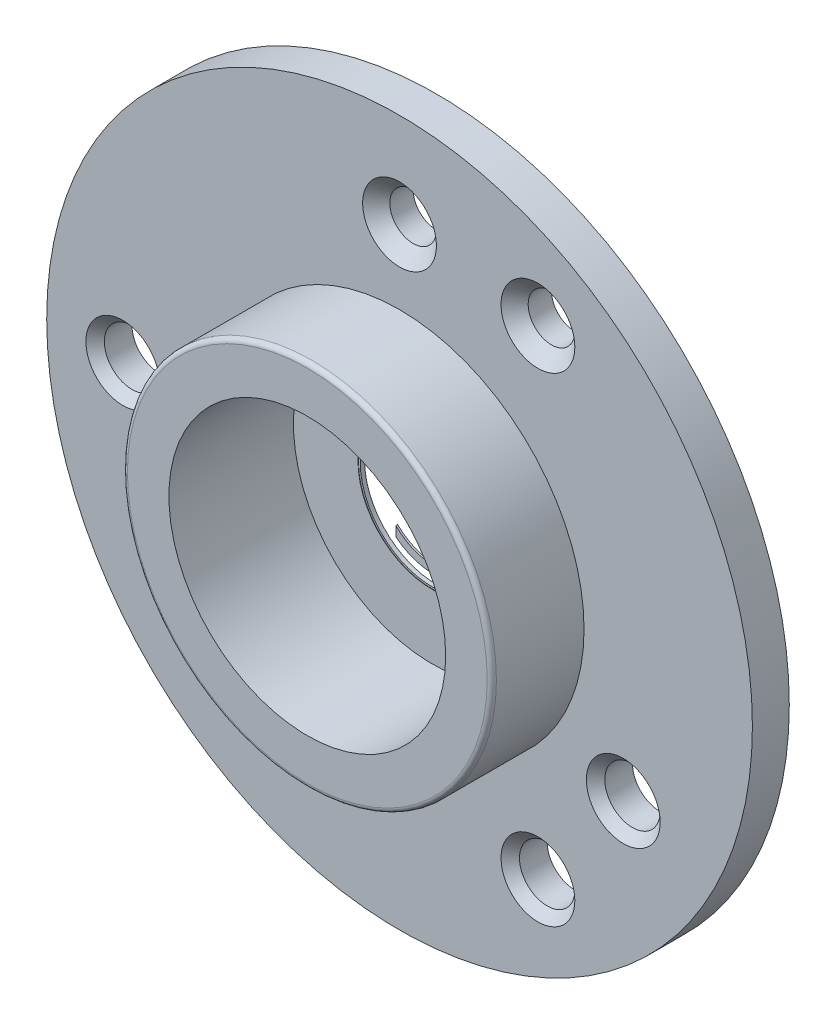
ISO-10303-21;
HEADER;
FILE_DESCRIPTION(('STEP AP214'),'2;1');
FILE_NAME('part.step','',(''),(''),'','','');
FILE_SCHEMA(('AUTOMOTIVE_DESIGN { 1 0 10303 214 1 1 1 1 }'));
ENDSEC;
DATA;
#1=APPLICATION_CONTEXT('core data for automotive mechanical design processes');
#2=APPLICATION_PROTOCOL_DEFINITION('international standard','automotive_design',2000,#1);
#3=PRODUCT_CONTEXT('',#1,'mechanical');
#4=PRODUCT('Part','Part','',(#3));
#5=PRODUCT_RELATED_PRODUCT_CATEGORY('part','',(#4));
#6=PRODUCT_DEFINITION_FORMATION('','',#4);
#7=PRODUCT_DEFINITION_CONTEXT('part definition',#1,'design');
#8=PRODUCT_DEFINITION('design','',#6,#7);
#9=PRODUCT_DEFINITION_SHAPE('','',#8);
#10=(LENGTH_UNIT() NAMED_UNIT(*) SI_UNIT(.MILLI.,.METRE.));
#11=(NAMED_UNIT(*) PLANE_ANGLE_UNIT() SI_UNIT($,.RADIAN.));
#12=(NAMED_UNIT(*) SI_UNIT($,.STERADIAN.) SOLID_ANGLE_UNIT());
#13=UNCERTAINTY_MEASURE_WITH_UNIT(LENGTH_MEASURE(1.E-05),#10,'distance_accuracy_value','');
#14=(GEOMETRIC_REPRESENTATION_CONTEXT(3) GLOBAL_UNCERTAINTY_ASSIGNED_CONTEXT((#13)) GLOBAL_UNIT_ASSIGNED_CONTEXT((#10,
#11,#12)) REPRESENTATION_CONTEXT('',''));
#15=CARTESIAN_POINT('',(0.,0.,0.));
#16=DIRECTION('',(0.,0.,1.));
#17=DIRECTION('',(1.,0.,0.));
#18=AXIS2_PLACEMENT_3D('',#15,#16,#17);
#19=CARTESIAN_POINT('',(0.,0.,41.25));
#20=DIRECTION('',(0.,0.,1.));
#21=DIRECTION('',(1.,0.,0.));
#22=AXIS2_PLACEMENT_3D('',#19,#20,#21);
#23=PLANE('',#22);
#24=CARTESIAN_POINT('',(0.,0.,41.25));
#25=DIRECTION('',(0.,0.,1.));
#26=DIRECTION('',(1.,0.,0.));
#27=AXIS2_PLACEMENT_3D('',#24,#25,#26);
#28=CIRCLE('',#27,7.5);
#29=CARTESIAN_POINT('',(7.5,0.,41.25));
#30=VERTEX_POINT('',#29);
#31=EDGE_CURVE('P0_E18',#30,#30,#28,.F.);
#32=ORIENTED_EDGE('',*,*,#31,.T.);
#33=EDGE_LOOP('',(#32));
#34=FACE_BOUND('',#33,.T.);
#35=CARTESIAN_POINT('',(0.,0.,41.25));
#36=DIRECTION('',(0.,0.,-1.));
#37=DIRECTION('',(-1.,0.,0.));
#38=AXIS2_PLACEMENT_3D('',#35,#36,#37);
#39=CIRCLE('',#38,9.75);
#40=CARTESIAN_POINT('',(-9.75,0.,41.25));
#41=VERTEX_POINT('',#40);
#42=EDGE_CURVE('P0_E89',#41,#41,#39,.T.);
#43=ORIENTED_EDGE('',*,*,#42,.F.);
#44=EDGE_LOOP('',(#43));
#45=FACE_BOUND('',#44,.T.);
#46=ADVANCED_FACE('P0_F14',(#34,#45),#23,.T.);
#47=CARTESIAN_POINT('',(0.,0.,40.));
#48=DIRECTION('',(0.,0.,1.));
#49=DIRECTION('',(1.,0.,0.));
#50=AXIS2_PLACEMENT_3D('',#47,#48,#49);
#51=CYLINDRICAL_SURFACE('',#50,7.5);
#52=CARTESIAN_POINT('',(0.,0.,34.5));
#53=DIRECTION('',(0.,0.,1.));
#54=DIRECTION('',(1.,0.,0.));
#55=AXIS2_PLACEMENT_3D('',#52,#53,#54);
#56=CIRCLE('',#55,7.5);
#57=CARTESIAN_POINT('',(7.5,0.,34.5));
#58=VERTEX_POINT('',#57);
#59=EDGE_CURVE('P0_E87',#58,#58,#56,.T.);
#60=ORIENTED_EDGE('',*,*,#59,.F.);
#61=EDGE_LOOP('',(#60));
#62=FACE_BOUND('',#61,.T.);
#63=ORIENTED_EDGE('',*,*,#31,.F.);
#64=EDGE_LOOP('',(#63));
#65=FACE_BOUND('',#64,.T.);
#66=ADVANCED_FACE('P0_F102',(#62,#65),#51,.F.);
#67=CARTESIAN_POINT('',(0.,0.,41.));
#68=DIRECTION('',(0.,0.,1.));
#69=DIRECTION('',(1.,0.,0.));
#70=AXIS2_PLACEMENT_3D('',#67,#68,#69);
#71=TOROIDAL_SURFACE('',#70,9.75,0.25);
#72=CARTESIAN_POINT('',(0.,0.,41.));
#73=DIRECTION('',(0.,0.,1.));
#74=DIRECTION('',(1.,0.,0.));
#75=AXIS2_PLACEMENT_3D('',#72,#73,#74);
#76=CIRCLE('',#75,10.);
#77=CARTESIAN_POINT('',(10.,0.,41.));
#78=VERTEX_POINT('',#77);
#79=EDGE_CURVE('P0_E86',#78,#78,#76,.F.);
#80=ORIENTED_EDGE('',*,*,#79,.F.);
#81=EDGE_LOOP('',(#80));
#82=FACE_BOUND('',#81,.T.);
#83=ORIENTED_EDGE('',*,*,#42,.T.);
#84=EDGE_LOOP('',(#83));
#85=FACE_BOUND('',#84,.T.);
#86=ADVANCED_FACE('P0_F104',(#82,#85),#71,.T.);
#87=CARTESIAN_POINT('',(0.,0.,34.5));
#88=DIRECTION('',(0.,0.,1.));
#89=DIRECTION('',(1.,0.,0.));
#90=AXIS2_PLACEMENT_3D('',#87,#88,#89);
#91=PLANE('',#90);
#92=CARTESIAN_POINT('',(0.,0.,34.5));
#93=DIRECTION('',(0.,0.,-1.));
#94=DIRECTION('',(-1.,0.,0.));
#95=AXIS2_PLACEMENT_3D('',#92,#93,#94);
#96=CIRCLE('',#95,4.);
#97=CARTESIAN_POINT('',(-4.,0.,34.5));
#98=VERTEX_POINT('',#97);
#99=EDGE_CURVE('P0_E84',#98,#98,#96,.T.);
#100=ORIENTED_EDGE('',*,*,#99,.T.);
#101=EDGE_LOOP('',(#100));
#102=FACE_BOUND('',#101,.T.);
#103=ORIENTED_EDGE('',*,*,#59,.T.);
#104=EDGE_LOOP('',(#103));
#105=FACE_BOUND('',#104,.T.);
#106=ADVANCED_FACE('P0_F111',(#102,#105),#91,.T.);
#107=CARTESIAN_POINT('',(0.,0.,36.25));
#108=DIRECTION('',(0.,0.,1.));
#109=DIRECTION('',(1.,0.,0.));
#110=AXIS2_PLACEMENT_3D('',#107,#108,#109);
#111=CYLINDRICAL_SURFACE('',#110,10.);
#112=CARTESIAN_POINT('',(0.,0.,36.25));
#113=DIRECTION('',(0.,0.,1.));
#114=DIRECTION('',(1.,0.,0.));
#115=AXIS2_PLACEMENT_3D('',#112,#113,#114);
#116=CIRCLE('',#115,10.);
#117=CARTESIAN_POINT('',(10.,0.,36.25));
#118=VERTEX_POINT('',#117);
#119=EDGE_CURVE('P0_E81',#118,#118,#116,.F.);
#120=ORIENTED_EDGE('',*,*,#119,.F.);
#121=EDGE_LOOP('',(#120));
#122=FACE_BOUND('',#121,.T.);
#123=ORIENTED_EDGE('',*,*,#79,.T.);
#124=EDGE_LOOP('',(#123));
#125=FACE_BOUND('',#124,.T.);
#126=ADVANCED_FACE('P0_F187',(#122,#125),#111,.T.);
#127=CARTESIAN_POINT('',(0.,0.,35.));
#128=DIRECTION('',(0.,0.,-1.));
#129=DIRECTION('',(-1.,0.,0.));
#130=AXIS2_PLACEMENT_3D('',#127,#128,#129);
#131=CYLINDRICAL_SURFACE('',#130,4.);
#132=CARTESIAN_POINT('',(0.,0.,34.48));
#133=DIRECTION('',(0.,0.,-1.));
#134=DIRECTION('',(-1.,0.,0.));
#135=AXIS2_PLACEMENT_3D('',#132,#133,#134);
#136=CIRCLE('',#135,4.);
#137=CARTESIAN_POINT('',(-4.,0.,34.48));
#138=VERTEX_POINT('',#137);
#139=EDGE_CURVE('P0_E60',#138,#138,#136,.F.);
#140=ORIENTED_EDGE('',*,*,#139,.F.);
#141=EDGE_LOOP('',(#140));
#142=FACE_BOUND('',#141,.T.);
#143=ORIENTED_EDGE('',*,*,#99,.F.);
#144=EDGE_LOOP('',(#143));
#145=FACE_BOUND('',#144,.T.);
#146=ADVANCED_FACE('P0_F183',(#142,#145),#131,.F.);
#147=CARTESIAN_POINT('',(0.,0.,36.25));
#148=DIRECTION('',(0.,0.,1.));
#149=DIRECTION('',(1.,0.,0.));
#150=AXIS2_PLACEMENT_3D('',#147,#148,#149);
#151=PLANE('',#150);
#152=CARTESIAN_POINT('',(7.5,12.9903810567666,36.2499999999886));
#153=DIRECTION('',(0.,0.,1.));
#154=DIRECTION('',(1.,0.,0.));
#155=AXIS2_PLACEMENT_3D('',#152,#153,#154);
#156=CIRCLE('',#155,2.00000000000955);
#157=CARTESIAN_POINT('',(9.50000000000955,12.9903810567666,36.2499999999886));
#158=VERTEX_POINT('',#157);
#159=EDGE_CURVE('P0_E75',#158,#158,#156,.F.);
#160=ORIENTED_EDGE('',*,*,#159,.T.);
#161=EDGE_LOOP('',(#160));
#162=FACE_BOUND('',#161,.T.);
#163=CARTESIAN_POINT('',(-12.1243556529821,-7.,36.2499999999914));
#164=DIRECTION('',(0.,0.,1.));
#165=DIRECTION('',(1.,0.,0.));
#166=AXIS2_PLACEMENT_3D('',#163,#164,#165);
#167=CIRCLE('',#166,2.00000000000955);
#168=CARTESIAN_POINT('',(-10.1243556529726,-7.,36.2499999999914));
#169=VERTEX_POINT('',#168);
#170=EDGE_CURVE('P0_E69',#169,#169,#167,.F.);
#171=ORIENTED_EDGE('',*,*,#170,.T.);
#172=EDGE_LOOP('',(#171));
#173=FACE_BOUND('',#172,.T.);
#174=CARTESIAN_POINT('',(7.5,-12.9903810567666,36.2499999999886));
#175=DIRECTION('',(0.,0.,1.));
#176=DIRECTION('',(1.,0.,0.));
#177=AXIS2_PLACEMENT_3D('',#174,#175,#176);
#178=CIRCLE('',#177,2.00000000000955);
#179=CARTESIAN_POINT('',(9.50000000000955,-12.9903810567666,36.2499999999886));
#180=VERTEX_POINT('',#179);
#181=EDGE_CURVE('P0_E63',#180,#180,#178,.F.);
#182=ORIENTED_EDGE('',*,*,#181,.T.);
#183=EDGE_LOOP('',(#182));
#184=FACE_BOUND('',#183,.T.);
#185=ORIENTED_EDGE('',*,*,#119,.T.);
#186=EDGE_LOOP('',(#185));
#187=FACE_BOUND('',#186,.T.);
#188=CARTESIAN_POINT('',(12.1243556529821,-7.00000000000001,36.2499999999995));
#189=DIRECTION('',(0.,0.,1.));
#190=DIRECTION('',(1.,0.,0.));
#191=AXIS2_PLACEMENT_3D('',#188,#189,#190);
#192=CIRCLE('',#191,2.00000000000955);
#193=CARTESIAN_POINT('',(14.1243556529916,-7.00000000000001,36.2499999999995));
#194=VERTEX_POINT('',#193);
#195=EDGE_CURVE('P0_E72',#194,#194,#192,.F.);
#196=ORIENTED_EDGE('',*,*,#195,.T.);
#197=EDGE_LOOP('',(#196));
#198=FACE_BOUND('',#197,.T.);
#199=CARTESIAN_POINT('',(-15.,0.,36.2500000000523));
#200=DIRECTION('',(0.,0.,1.));
#201=DIRECTION('',(1.,0.,0.));
#202=AXIS2_PLACEMENT_3D('',#199,#200,#201);
#203=CIRCLE('',#202,2.00000000010959);
#204=CARTESIAN_POINT('',(-12.9999999998904,0.,36.2500000000523));
#205=VERTEX_POINT('',#204);
#206=EDGE_CURVE('P0_E78',#205,#205,#203,.F.);
#207=ORIENTED_EDGE('',*,*,#206,.T.);
#208=EDGE_LOOP('',(#207));
#209=FACE_BOUND('',#208,.T.);
#210=CARTESIAN_POINT('',(0.,14.,36.2499999999955));
#211=DIRECTION('',(0.,0.,1.));
#212=DIRECTION('',(1.,0.,0.));
#213=AXIS2_PLACEMENT_3D('',#210,#211,#212);
#214=CIRCLE('',#213,2.00000000000955);
#215=CARTESIAN_POINT('',(2.00000000000955,14.,36.2499999999955));
#216=VERTEX_POINT('',#215);
#217=EDGE_CURVE('P0_E66',#216,#216,#214,.F.);
#218=ORIENTED_EDGE('',*,*,#217,.T.);
#219=EDGE_LOOP('',(#218));
#220=FACE_BOUND('',#219,.T.);
#221=CARTESIAN_POINT('',(0.,0.,36.25));
#222=DIRECTION('',(0.,0.,1.));
#223=DIRECTION('',(1.,0.,0.));
#224=AXIS2_PLACEMENT_3D('',#221,#222,#223);
#225=CIRCLE('',#224,19.125);
#226=CARTESIAN_POINT('',(19.125,0.,36.25));
#227=VERTEX_POINT('',#226);
#228=EDGE_CURVE('P0_E56',#227,#227,#225,.F.);
#229=ORIENTED_EDGE('',*,*,#228,.F.);
#230=EDGE_LOOP('',(#229));
#231=FACE_BOUND('',#230,.T.);
#232=ADVANCED_FACE('P0_F179',(#162,#173,#184,#187,#198,#209,#220,#231),#151,.T.);
#233=CARTESIAN_POINT('',(-15.,0.,36.2499999999386));
#234=DIRECTION('',(0.,0.,1.));
#235=DIRECTION('',(1.,0.,0.));
#236=AXIS2_PLACEMENT_3D('',#233,#234,#235);
#237=CONICAL_SURFACE('',#236,1.99999999999591,0.785398163340605);
#238=CARTESIAN_POINT('',(-15.,0.,35.75));
#239=DIRECTION('',(0.,0.,-1.));
#240=DIRECTION('',(-1.,0.,0.));
#241=AXIS2_PLACEMENT_3D('',#238,#239,#240);
#242=CIRCLE('',#241,1.5);
#243=CARTESIAN_POINT('',(-16.5,0.,35.75));
#244=VERTEX_POINT('',#243);
#245=EDGE_CURVE('P0_E59',#244,#244,#242,.T.);
#246=ORIENTED_EDGE('',*,*,#245,.T.);
#247=EDGE_LOOP('',(#246));
#248=FACE_BOUND('',#247,.T.);
#249=ORIENTED_EDGE('',*,*,#206,.F.);
#250=EDGE_LOOP('',(#249));
#251=FACE_BOUND('',#250,.T.);
#252=ADVANCED_FACE('P0_F175',(#248,#251),#237,.F.);
#253=CARTESIAN_POINT('',(7.5,12.9903810567666,36.2499999998818));
#254=DIRECTION('',(0.,0.,1.));
#255=DIRECTION('',(1.,0.,0.));
#256=AXIS2_PLACEMENT_3D('',#253,#254,#255);
#257=CONICAL_SURFACE('',#256,1.99999999990268,0.785398163397448);
#258=CARTESIAN_POINT('',(7.5,12.9903810567666,35.5145));
#259=DIRECTION('',(0.,0.,-1.));
#260=DIRECTION('',(-1.,0.,0.));
#261=AXIS2_PLACEMENT_3D('',#258,#259,#260);
#262=CIRCLE('',#261,1.2645);
#263=CARTESIAN_POINT('',(6.2355,12.9903810567666,35.5145));
#264=VERTEX_POINT('',#263);
#265=EDGE_CURVE('P0_E209',#264,#264,#262,.T.);
#266=ORIENTED_EDGE('',*,*,#265,.T.);
#267=EDGE_LOOP('',(#266));
#268=FACE_BOUND('',#267,.T.);
#269=ORIENTED_EDGE('',*,*,#159,.F.);
#270=EDGE_LOOP('',(#269));
#271=FACE_BOUND('',#270,.T.);
#272=ADVANCED_FACE('P0_F171',(#268,#271),#257,.F.);
#273=CARTESIAN_POINT('',(12.1243556529821,-7.00000000000001,36.2499999998818));
#274=DIRECTION('',(0.,0.,1.));
#275=DIRECTION('',(1.,0.,0.));
#276=AXIS2_PLACEMENT_3D('',#273,#274,#275);
#277=CONICAL_SURFACE('',#276,1.99999999989177,0.785398163397448);
#278=CARTESIAN_POINT('',(12.1243556529821,-7.00000000000001,35.75));
#279=DIRECTION('',(0.,0.,-1.));
#280=DIRECTION('',(-1.,0.,0.));
#281=AXIS2_PLACEMENT_3D('',#278,#279,#280);
#282=CIRCLE('',#281,1.5);
#283=CARTESIAN_POINT('',(10.6243556529821,-7.00000000000001,35.75));
#284=VERTEX_POINT('',#283);
#285=EDGE_CURVE('P0_E212',#284,#284,#282,.T.);
#286=ORIENTED_EDGE('',*,*,#285,.T.);
#287=EDGE_LOOP('',(#286));
#288=FACE_BOUND('',#287,.T.);
#289=ORIENTED_EDGE('',*,*,#195,.F.);
#290=EDGE_LOOP('',(#289));
#291=FACE_BOUND('',#290,.T.);
#292=ADVANCED_FACE('P0_F167',(#288,#291),#277,.F.);
#293=CARTESIAN_POINT('',(-12.1243556529821,-7.,36.2499999998818));
#294=DIRECTION('',(0.,0.,1.));
#295=DIRECTION('',(1.,0.,0.));
#296=AXIS2_PLACEMENT_3D('',#293,#294,#295);
#297=CONICAL_SURFACE('',#296,1.99999999989996,0.785398163397448);
#298=CARTESIAN_POINT('',(-12.1243556529821,-7.,35.75));
#299=DIRECTION('',(0.,0.,-1.));
#300=DIRECTION('',(-1.,0.,0.));
#301=AXIS2_PLACEMENT_3D('',#298,#299,#300);
#302=CIRCLE('',#301,1.5);
#303=CARTESIAN_POINT('',(-13.6243556529821,-7.,35.75));
#304=VERTEX_POINT('',#303);
#305=EDGE_CURVE('P0_E215',#304,#304,#302,.T.);
#306=ORIENTED_EDGE('',*,*,#305,.T.);
#307=EDGE_LOOP('',(#306));
#308=FACE_BOUND('',#307,.T.);
#309=ORIENTED_EDGE('',*,*,#170,.F.);
#310=EDGE_LOOP('',(#309));
#311=FACE_BOUND('',#310,.T.);
#312=ADVANCED_FACE('P0_F163',(#308,#311),#297,.F.);
#313=CARTESIAN_POINT('',(0.,14.,36.2499999999386));
#314=DIRECTION('',(0.,0.,1.));
#315=DIRECTION('',(1.,0.,0.));
#316=AXIS2_PLACEMENT_3D('',#313,#314,#315);
#317=CONICAL_SURFACE('',#316,1.99999999995271,0.785398163436091);
#318=CARTESIAN_POINT('',(0.,14.,35.5145));
#319=DIRECTION('',(0.,0.,-1.));
#320=DIRECTION('',(-1.,0.,0.));
#321=AXIS2_PLACEMENT_3D('',#318,#319,#320);
#322=CIRCLE('',#321,1.2645);
#323=CARTESIAN_POINT('',(-1.2645,14.,35.5145));
#324=VERTEX_POINT('',#323);
#325=EDGE_CURVE('P0_E218',#324,#324,#322,.T.);
#326=ORIENTED_EDGE('',*,*,#325,.T.);
#327=EDGE_LOOP('',(#326));
#328=FACE_BOUND('',#327,.T.);
#329=ORIENTED_EDGE('',*,*,#217,.F.);
#330=EDGE_LOOP('',(#329));
#331=FACE_BOUND('',#330,.T.);
#332=ADVANCED_FACE('P0_F159',(#328,#331),#317,.F.);
#333=CARTESIAN_POINT('',(7.5,-12.9903810567666,36.2499999998818));
#334=DIRECTION('',(0.,0.,1.));
#335=DIRECTION('',(1.,0.,0.));
#336=AXIS2_PLACEMENT_3D('',#333,#334,#335);
#337=CONICAL_SURFACE('',#336,1.99999999990268,0.785398163397448);
#338=CARTESIAN_POINT('',(7.5,-12.9903810567666,35.75));
#339=DIRECTION('',(0.,0.,-1.));
#340=DIRECTION('',(-1.,0.,0.));
#341=AXIS2_PLACEMENT_3D('',#338,#339,#340);
#342=CIRCLE('',#341,1.5);
#343=CARTESIAN_POINT('',(6.,-12.9903810567666,35.75));
#344=VERTEX_POINT('',#343);
#345=EDGE_CURVE('P0_E55',#344,#344,#342,.T.);
#346=ORIENTED_EDGE('',*,*,#345,.T.);
#347=EDGE_LOOP('',(#346));
#348=FACE_BOUND('',#347,.T.);
#349=ORIENTED_EDGE('',*,*,#181,.F.);
#350=EDGE_LOOP('',(#349));
#351=FACE_BOUND('',#350,.T.);
#352=ADVANCED_FACE('P0_F155',(#348,#351),#337,.F.);
#353=CARTESIAN_POINT('',(0.,0.,34.48));
#354=DIRECTION('',(0.,0.,1.));
#355=DIRECTION('',(1.,0.,0.));
#356=AXIS2_PLACEMENT_3D('',#353,#354,#355);
#357=PLANE('',#356);
#358=CARTESIAN_POINT('',(0.,0.,34.48));
#359=DIRECTION('',(0.,0.,-1.));
#360=DIRECTION('',(-1.,0.,0.));
#361=AXIS2_PLACEMENT_3D('',#358,#359,#360);
#362=CIRCLE('',#361,3.9);
#363=CARTESIAN_POINT('',(-3.9,0.,34.48));
#364=VERTEX_POINT('',#363);
#365=EDGE_CURVE('P0_E52',#364,#364,#362,.T.);
#366=ORIENTED_EDGE('',*,*,#365,.T.);
#367=EDGE_LOOP('',(#366));
#368=FACE_BOUND('',#367,.T.);
#369=ORIENTED_EDGE('',*,*,#139,.T.);
#370=EDGE_LOOP('',(#369));
#371=FACE_BOUND('',#370,.T.);
#372=ADVANCED_FACE('P0_F151',(#368,#371),#357,.T.);
#373=CARTESIAN_POINT('',(0.,0.,0.));
#374=DIRECTION('',(0.,0.,1.));
#375=DIRECTION('',(1.,0.,0.));
#376=AXIS2_PLACEMENT_3D('',#373,#374,#375);
#377=CYLINDRICAL_SURFACE('',#376,19.125);
#378=ORIENTED_EDGE('',*,*,#228,.T.);
#379=EDGE_LOOP('',(#378));
#380=FACE_BOUND('',#379,.T.);
#381=CARTESIAN_POINT('',(0.,0.,34.25));
#382=DIRECTION('',(0.,0.,1.));
#383=DIRECTION('',(1.,0.,0.));
#384=AXIS2_PLACEMENT_3D('',#381,#382,#383);
#385=CIRCLE('',#384,19.125);
#386=CARTESIAN_POINT('',(19.125,0.,34.25));
#387=VERTEX_POINT('',#386);
#388=EDGE_CURVE('P0_E49',#387,#387,#385,.T.);
#389=ORIENTED_EDGE('',*,*,#388,.T.);
#390=EDGE_LOOP('',(#389));
#391=FACE_BOUND('',#390,.T.);
#392=ADVANCED_FACE('P0_F147',(#380,#391),#377,.T.);
#393=CARTESIAN_POINT('',(-15.,0.,36.25));
#394=DIRECTION('',(0.,0.,-1.));
#395=DIRECTION('',(-1.,0.,0.));
#396=AXIS2_PLACEMENT_3D('',#393,#394,#395);
#397=CYLINDRICAL_SURFACE('',#396,1.5);
#398=CARTESIAN_POINT('',(-15.,0.,34.25));
#399=DIRECTION('',(0.,0.,-1.));
#400=DIRECTION('',(-1.,0.,0.));
#401=AXIS2_PLACEMENT_3D('',#398,#399,#400);
#402=CIRCLE('',#401,1.5);
#403=CARTESIAN_POINT('',(-16.5,0.,34.25));
#404=VERTEX_POINT('',#403);
#405=EDGE_CURVE('P0_E46',#404,#404,#402,.T.);
#406=ORIENTED_EDGE('',*,*,#405,.T.);
#407=EDGE_LOOP('',(#406));
#408=FACE_BOUND('',#407,.T.);
#409=ORIENTED_EDGE('',*,*,#245,.F.);
#410=EDGE_LOOP('',(#409));
#411=FACE_BOUND('',#410,.T.);
#412=ADVANCED_FACE('P0_F143',(#408,#411),#397,.F.);
#413=CARTESIAN_POINT('',(7.5,12.9903810567666,36.25));
#414=DIRECTION('',(0.,0.,-1.));
#415=DIRECTION('',(-1.,0.,0.));
#416=AXIS2_PLACEMENT_3D('',#413,#414,#415);
#417=CYLINDRICAL_SURFACE('',#416,1.2645);
#418=CARTESIAN_POINT('',(7.5,12.9903810567666,34.25));
#419=DIRECTION('',(0.,0.,-1.));
#420=DIRECTION('',(-1.,0.,0.));
#421=AXIS2_PLACEMENT_3D('',#418,#419,#420);
#422=CIRCLE('',#421,1.2645);
#423=CARTESIAN_POINT('',(6.2355,12.9903810567666,34.25));
#424=VERTEX_POINT('',#423);
#425=EDGE_CURVE('P0_E43',#424,#424,#422,.T.);
#426=ORIENTED_EDGE('',*,*,#425,.T.);
#427=EDGE_LOOP('',(#426));
#428=FACE_BOUND('',#427,.T.);
#429=ORIENTED_EDGE('',*,*,#265,.F.);
#430=EDGE_LOOP('',(#429));
#431=FACE_BOUND('',#430,.T.);
#432=ADVANCED_FACE('P0_F139',(#428,#431),#417,.F.);
#433=CARTESIAN_POINT('',(12.1243556529821,-7.00000000000001,36.25));
#434=DIRECTION('',(0.,0.,-1.));
#435=DIRECTION('',(-1.,0.,0.));
#436=AXIS2_PLACEMENT_3D('',#433,#434,#435);
#437=CYLINDRICAL_SURFACE('',#436,1.5);
#438=CARTESIAN_POINT('',(12.1243556529821,-7.00000000000001,34.25));
#439=DIRECTION('',(0.,0.,-1.));
#440=DIRECTION('',(-1.,0.,0.));
#441=AXIS2_PLACEMENT_3D('',#438,#439,#440);
#442=CIRCLE('',#441,1.5);
#443=CARTESIAN_POINT('',(10.6243556529821,-7.00000000000001,34.25));
#444=VERTEX_POINT('',#443);
#445=EDGE_CURVE('P0_E40',#444,#444,#442,.T.);
#446=ORIENTED_EDGE('',*,*,#445,.T.);
#447=EDGE_LOOP('',(#446));
#448=FACE_BOUND('',#447,.T.);
#449=ORIENTED_EDGE('',*,*,#285,.F.);
#450=EDGE_LOOP('',(#449));
#451=FACE_BOUND('',#450,.T.);
#452=ADVANCED_FACE('P0_F135',(#448,#451),#437,.F.);
#453=CARTESIAN_POINT('',(-12.1243556529821,-7.,36.25));
#454=DIRECTION('',(0.,0.,-1.));
#455=DIRECTION('',(-1.,0.,0.));
#456=AXIS2_PLACEMENT_3D('',#453,#454,#455);
#457=CYLINDRICAL_SURFACE('',#456,1.5);
#458=CARTESIAN_POINT('',(-12.1243556529821,-7.,34.25));
#459=DIRECTION('',(0.,0.,-1.));
#460=DIRECTION('',(-1.,0.,0.));
#461=AXIS2_PLACEMENT_3D('',#458,#459,#460);
#462=CIRCLE('',#461,1.5);
#463=CARTESIAN_POINT('',(-13.6243556529821,-7.,34.25));
#464=VERTEX_POINT('',#463);
#465=EDGE_CURVE('P0_E37',#464,#464,#462,.T.);
#466=ORIENTED_EDGE('',*,*,#465,.T.);
#467=EDGE_LOOP('',(#466));
#468=FACE_BOUND('',#467,.T.);
#469=ORIENTED_EDGE('',*,*,#305,.F.);
#470=EDGE_LOOP('',(#469));
#471=FACE_BOUND('',#470,.T.);
#472=ADVANCED_FACE('P0_F131',(#468,#471),#457,.F.);
#473=CARTESIAN_POINT('',(0.,14.,36.25));
#474=DIRECTION('',(0.,0.,-1.));
#475=DIRECTION('',(-1.,0.,0.));
#476=AXIS2_PLACEMENT_3D('',#473,#474,#475);
#477=CYLINDRICAL_SURFACE('',#476,1.2645);
#478=CARTESIAN_POINT('',(0.,14.,34.25));
#479=DIRECTION('',(0.,0.,-1.));
#480=DIRECTION('',(-1.,0.,0.));
#481=AXIS2_PLACEMENT_3D('',#478,#479,#480);
#482=CIRCLE('',#481,1.2645);
#483=CARTESIAN_POINT('',(-1.2645,14.,34.25));
#484=VERTEX_POINT('',#483);
#485=EDGE_CURVE('P0_E27',#484,#484,#482,.T.);
#486=ORIENTED_EDGE('',*,*,#485,.T.);
#487=EDGE_LOOP('',(#486));
#488=FACE_BOUND('',#487,.T.);
#489=ORIENTED_EDGE('',*,*,#325,.F.);
#490=EDGE_LOOP('',(#489));
#491=FACE_BOUND('',#490,.T.);
#492=ADVANCED_FACE('P0_F127',(#488,#491),#477,.F.);
#493=CARTESIAN_POINT('',(7.5,-12.9903810567666,36.25));
#494=DIRECTION('',(0.,0.,-1.));
#495=DIRECTION('',(-1.,0.,0.));
#496=AXIS2_PLACEMENT_3D('',#493,#494,#495);
#497=CYLINDRICAL_SURFACE('',#496,1.5);
#498=CARTESIAN_POINT('',(7.5,-12.9903810567666,34.25));
#499=DIRECTION('',(0.,0.,-1.));
#500=DIRECTION('',(-1.,0.,0.));
#501=AXIS2_PLACEMENT_3D('',#498,#499,#500);
#502=CIRCLE('',#501,1.5);
#503=CARTESIAN_POINT('',(6.,-12.9903810567666,34.25));
#504=VERTEX_POINT('',#503);
#505=EDGE_CURVE('P0_E22',#504,#504,#502,.T.);
#506=ORIENTED_EDGE('',*,*,#505,.T.);
#507=EDGE_LOOP('',(#506));
#508=FACE_BOUND('',#507,.T.);
#509=ORIENTED_EDGE('',*,*,#345,.F.);
#510=EDGE_LOOP('',(#509));
#511=FACE_BOUND('',#510,.T.);
#512=ADVANCED_FACE('P0_F121',(#508,#511),#497,.F.);
#513=CARTESIAN_POINT('',(0.,0.,35.75));
#514=DIRECTION('',(0.,0.,-1.));
#515=DIRECTION('',(-1.,0.,0.));
#516=AXIS2_PLACEMENT_3D('',#513,#514,#515);
#517=CYLINDRICAL_SURFACE('',#516,3.9);
#518=CARTESIAN_POINT('',(0.,0.,34.25));
#519=DIRECTION('',(0.,0.,-1.));
#520=DIRECTION('',(-1.,0.,0.));
#521=AXIS2_PLACEMENT_3D('',#518,#519,#520);
#522=CIRCLE('',#521,3.9);
#523=CARTESIAN_POINT('',(-3.9,0.,34.25));
#524=VERTEX_POINT('',#523);
#525=EDGE_CURVE('P0_E10',#524,#524,#522,.T.);
#526=ORIENTED_EDGE('',*,*,#525,.T.);
#527=EDGE_LOOP('',(#526));
#528=FACE_BOUND('',#527,.T.);
#529=ORIENTED_EDGE('',*,*,#365,.F.);
#530=EDGE_LOOP('',(#529));
#531=FACE_BOUND('',#530,.T.);
#532=ADVANCED_FACE('P0_F115',(#528,#531),#517,.F.);
#533=CARTESIAN_POINT('',(0.,0.,34.25));
#534=DIRECTION('',(0.,0.,1.));
#535=DIRECTION('',(1.,0.,0.));
#536=AXIS2_PLACEMENT_3D('',#533,#534,#535);
#537=PLANE('',#536);
#538=ORIENTED_EDGE('',*,*,#525,.F.);
#539=EDGE_LOOP('',(#538));
#540=FACE_BOUND('',#539,.T.);
#541=ORIENTED_EDGE('',*,*,#505,.F.);
#542=EDGE_LOOP('',(#541));
#543=FACE_BOUND('',#542,.T.);
#544=ORIENTED_EDGE('',*,*,#485,.F.);
#545=EDGE_LOOP('',(#544));
#546=FACE_BOUND('',#545,.T.);
#547=ORIENTED_EDGE('',*,*,#465,.F.);
#548=EDGE_LOOP('',(#547));
#549=FACE_BOUND('',#548,.T.);
#550=ORIENTED_EDGE('',*,*,#445,.F.);
#551=EDGE_LOOP('',(#550));
#552=FACE_BOUND('',#551,.T.);
#553=ORIENTED_EDGE('',*,*,#425,.F.);
#554=EDGE_LOOP('',(#553));
#555=FACE_BOUND('',#554,.T.);
#556=ORIENTED_EDGE('',*,*,#405,.F.);
#557=EDGE_LOOP('',(#556));
#558=FACE_BOUND('',#557,.T.);
#559=ORIENTED_EDGE('',*,*,#388,.F.);
#560=EDGE_LOOP('',(#559));
#561=FACE_BOUND('',#560,.T.);
#562=ADVANCED_FACE('P0_F113',(#540,#543,#546,#549,#552,#555,#558,#561),#537,.F.);
#563=CLOSED_SHELL('',(#46,#66,#86,#106,#126,#146,#232,#252,#272,#292,#312,#332,#352,#372,#392,
#412,#432,#452,#472,#492,#512,#532,#562));
#564=MANIFOLD_SOLID_BREP('P0_B1',#563);
#565=CARTESIAN_POINT('',(0.647552856132355,0.,34.35));
#566=DIRECTION('',(0.,0.,1.));
#567=DIRECTION('',(1.,0.,0.));
#568=AXIS2_PLACEMENT_3D('',#565,#566,#567);
#569=PLANE('',#568);
#570=DIRECTION('',(0.,1.,0.));
#571=VECTOR('',#570,1.);
#572=CARTESIAN_POINT('',(-2.10489428773529,2.67009738351607,34.35));
#573=LINE('',#572,#571);
#574=CARTESIAN_POINT('',(-2.10489428773529,2.67009738351607,34.35));
#575=VERTEX_POINT('',#574);
#576=CARTESIAN_POINT('',(-2.10489428773529,2.13762018082243,34.35));
#577=VERTEX_POINT('',#576);
#578=EDGE_CURVE('P1_E53',#575,#577,#573,.F.);
#579=ORIENTED_EDGE('',*,*,#578,.T.);
#580=CARTESIAN_POINT('',(0.,0.,34.35));
#581=DIRECTION('',(0.,0.,-1.));
#582=DIRECTION('',(-1.,0.,0.));
#583=AXIS2_PLACEMENT_3D('',#580,#581,#582);
#584=CIRCLE('',#583,3.);
#585=CARTESIAN_POINT('',(-2.10489428773529,-2.13762018082244,34.35));
#586=VERTEX_POINT('',#585);
#587=EDGE_CURVE('P1_E19',#577,#586,#584,.T.);
#588=ORIENTED_EDGE('',*,*,#587,.T.);
#589=DIRECTION('',(0.,1.,0.));
#590=VECTOR('',#589,1.);
#591=CARTESIAN_POINT('',(-2.10489428773529,-2.13762018082244,34.35));
#592=LINE('',#591,#590);
#593=CARTESIAN_POINT('',(-2.10489428773529,-2.67009738351607,34.35));
#594=VERTEX_POINT('',#593);
#595=EDGE_CURVE('P1_E57',#586,#594,#592,.F.);
#596=ORIENTED_EDGE('',*,*,#595,.T.);
#597=CARTESIAN_POINT('',(0.,0.,34.35));
#598=DIRECTION('',(0.,0.,1.));
#599=DIRECTION('',(1.,0.,0.));
#600=AXIS2_PLACEMENT_3D('',#597,#598,#599);
#601=CIRCLE('',#600,3.4);
#602=EDGE_CURVE('P1_E67',#575,#594,#601,.F.);
#603=ORIENTED_EDGE('',*,*,#602,.F.);
#604=EDGE_LOOP('',(#579,#588,#596,#603));
#605=FACE_BOUND('',#604,.T.);
#606=ADVANCED_FACE('P1_F16',(#605),#569,.T.);
#607=CARTESIAN_POINT('',(-2.10489428773529,2.67009738351607,34.95));
#608=DIRECTION('',(1.,0.,0.));
#609=DIRECTION('',(0.,1.,0.));
#610=AXIS2_PLACEMENT_3D('',#607,#608,#609);
#611=PLANE('',#610);
#612=DIRECTION('',(0.,0.,-1.));
#613=VECTOR('',#612,1.);
#614=CARTESIAN_POINT('',(-2.10489428773529,2.13762018082243,34.95));
#615=LINE('',#614,#613);
#616=CARTESIAN_POINT('',(-2.10489428773529,2.13762018082243,34.25));
#617=VERTEX_POINT('',#616);
#618=EDGE_CURVE('P1_E62',#617,#577,#615,.F.);
#619=ORIENTED_EDGE('',*,*,#618,.T.);
#620=ORIENTED_EDGE('',*,*,#578,.F.);
#621=DIRECTION('',(0.,0.,1.));
#622=VECTOR('',#621,1.);
#623=CARTESIAN_POINT('',(-2.10489428773529,2.67009738351607,40.));
#624=LINE('',#623,#622);
#625=CARTESIAN_POINT('',(-2.10489428773529,2.67009738351607,34.25));
#626=VERTEX_POINT('',#625);
#627=EDGE_CURVE('P1_E76',#626,#575,#624,.T.);
#628=ORIENTED_EDGE('',*,*,#627,.F.);
#629=DIRECTION('',(0.,1.,0.));
#630=VECTOR('',#629,1.);
#631=CARTESIAN_POINT('',(-2.10489428773529,0.,34.25));
#632=LINE('',#631,#630);
#633=EDGE_CURVE('P1_E80',#626,#617,#632,.F.);
#634=ORIENTED_EDGE('',*,*,#633,.T.);
#635=EDGE_LOOP('',(#619,#620,#628,#634));
#636=FACE_BOUND('',#635,.T.);
#637=ADVANCED_FACE('P1_F90',(#636),#611,.F.);
#638=CARTESIAN_POINT('',(0.,0.,34.95));
#639=DIRECTION('',(0.,0.,-1.));
#640=DIRECTION('',(-1.,0.,0.));
#641=AXIS2_PLACEMENT_3D('',#638,#639,#640);
#642=CYLINDRICAL_SURFACE('',#641,3.);
#643=DIRECTION('',(0.,0.,1.));
#644=VECTOR('',#643,1.);
#645=CARTESIAN_POINT('',(-2.10489428773529,-2.13762018082244,34.95));
#646=LINE('',#645,#644);
#647=CARTESIAN_POINT('',(-2.10489428773529,-2.13762018082244,34.25));
#648=VERTEX_POINT('',#647);
#649=EDGE_CURVE('P1_E61',#648,#586,#646,.T.);
#650=ORIENTED_EDGE('',*,*,#649,.T.);
#651=ORIENTED_EDGE('',*,*,#587,.F.);
#652=ORIENTED_EDGE('',*,*,#618,.F.);
#653=CARTESIAN_POINT('',(0.,0.,34.25));
#654=DIRECTION('',(0.,0.,-1.));
#655=DIRECTION('',(-1.,0.,0.));
#656=AXIS2_PLACEMENT_3D('',#653,#654,#655);
#657=CIRCLE('',#656,3.);
#658=EDGE_CURVE('P1_E72',#617,#648,#657,.T.);
#659=ORIENTED_EDGE('',*,*,#658,.T.);
#660=EDGE_LOOP('',(#650,#651,#652,#659));
#661=FACE_BOUND('',#660,.T.);
#662=ADVANCED_FACE('P1_F70',(#661),#642,.F.);
#663=CARTESIAN_POINT('',(-2.10489428773529,-2.13762018082244,34.95));
#664=DIRECTION('',(1.,0.,0.));
#665=DIRECTION('',(0.,1.,0.));
#666=AXIS2_PLACEMENT_3D('',#663,#664,#665);
#667=PLANE('',#666);
#668=DIRECTION('',(0.,0.,1.));
#669=VECTOR('',#668,1.);
#670=CARTESIAN_POINT('',(-2.10489428773529,-2.67009738351607,40.));
#671=LINE('',#670,#669);
#672=CARTESIAN_POINT('',(-2.10489428773529,-2.67009738351607,34.25));
#673=VERTEX_POINT('',#672);
#674=EDGE_CURVE('P1_E33',#594,#673,#671,.F.);
#675=ORIENTED_EDGE('',*,*,#674,.F.);
#676=ORIENTED_EDGE('',*,*,#595,.F.);
#677=ORIENTED_EDGE('',*,*,#649,.F.);
#678=DIRECTION('',(0.,1.,0.));
#679=VECTOR('',#678,1.);
#680=CARTESIAN_POINT('',(-2.10489428773529,0.,34.25));
#681=LINE('',#680,#679);
#682=EDGE_CURVE('P1_E25',#648,#673,#681,.F.);
#683=ORIENTED_EDGE('',*,*,#682,.T.);
#684=EDGE_LOOP('',(#675,#676,#677,#683));
#685=FACE_BOUND('',#684,.T.);
#686=ADVANCED_FACE('P1_F64',(#685),#667,.F.);
#687=CARTESIAN_POINT('',(0.,0.,40.));
#688=DIRECTION('',(0.,0.,1.));
#689=DIRECTION('',(1.,0.,0.));
#690=AXIS2_PLACEMENT_3D('',#687,#688,#689);
#691=CYLINDRICAL_SURFACE('',#690,3.4);
#692=CARTESIAN_POINT('',(0.,0.,34.25));
#693=DIRECTION('',(0.,0.,1.));
#694=DIRECTION('',(1.,0.,0.));
#695=AXIS2_PLACEMENT_3D('',#692,#693,#694);
#696=CIRCLE('',#695,3.4);
#697=EDGE_CURVE('P1_E11',#673,#626,#696,.T.);
#698=ORIENTED_EDGE('',*,*,#697,.T.);
#699=ORIENTED_EDGE('',*,*,#627,.T.);
#700=ORIENTED_EDGE('',*,*,#602,.T.);
#701=ORIENTED_EDGE('',*,*,#674,.T.);
#702=EDGE_LOOP('',(#698,#699,#700,#701));
#703=FACE_BOUND('',#702,.T.);
#704=ADVANCED_FACE('P1_F88',(#703),#691,.T.);
#705=CARTESIAN_POINT('',(0.,0.,34.25));
#706=DIRECTION('',(0.,0.,1.));
#707=DIRECTION('',(1.,0.,0.));
#708=AXIS2_PLACEMENT_3D('',#705,#706,#707);
#709=PLANE('',#708);
#710=ORIENTED_EDGE('',*,*,#682,.F.);
#711=ORIENTED_EDGE('',*,*,#658,.F.);
#712=ORIENTED_EDGE('',*,*,#633,.F.);
#713=ORIENTED_EDGE('',*,*,#697,.F.);
#714=EDGE_LOOP('',(#710,#711,#712,#713));
#715=FACE_BOUND('',#714,.T.);
#716=ADVANCED_FACE('P1_F86',(#715),#709,.F.);
#717=CLOSED_SHELL('',(#606,#637,#662,#686,#704,#716));
#718=MANIFOLD_SOLID_BREP('P1_B1',#717);
#719=ADVANCED_BREP_SHAPE_REPRESENTATION('',(#18,#564,#718),#14);
#720=SHAPE_DEFINITION_REPRESENTATION(#9,#719);
ENDSEC;
END-ISO-10303-21;
